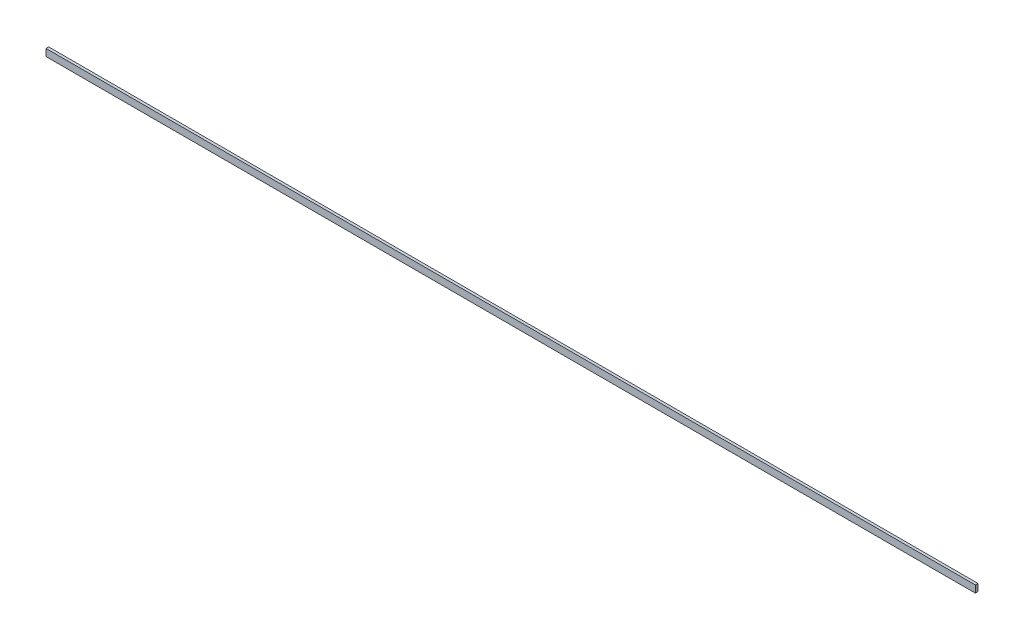
ISO-10303-21;
HEADER;
FILE_DESCRIPTION(('STEP AP214'),'2;1');
FILE_NAME('part.step','',(''),(''),'','','');
FILE_SCHEMA(('AUTOMOTIVE_DESIGN { 1 0 10303 214 1 1 1 1 }'));
ENDSEC;
DATA;
#1=APPLICATION_CONTEXT('core data for automotive mechanical design processes');
#2=APPLICATION_PROTOCOL_DEFINITION('international standard','automotive_design',2000,#1);
#3=PRODUCT_CONTEXT('',#1,'mechanical');
#4=PRODUCT('Part','Part','',(#3));
#5=PRODUCT_RELATED_PRODUCT_CATEGORY('part','',(#4));
#6=PRODUCT_DEFINITION_FORMATION('','',#4);
#7=PRODUCT_DEFINITION_CONTEXT('part definition',#1,'design');
#8=PRODUCT_DEFINITION('design','',#6,#7);
#9=PRODUCT_DEFINITION_SHAPE('','',#8);
#10=(LENGTH_UNIT() NAMED_UNIT(*) SI_UNIT(.MILLI.,.METRE.));
#11=(NAMED_UNIT(*) PLANE_ANGLE_UNIT() SI_UNIT($,.RADIAN.));
#12=(NAMED_UNIT(*) SI_UNIT($,.STERADIAN.) SOLID_ANGLE_UNIT());
#13=UNCERTAINTY_MEASURE_WITH_UNIT(LENGTH_MEASURE(1.E-05),#10,'distance_accuracy_value','');
#14=(GEOMETRIC_REPRESENTATION_CONTEXT(3) GLOBAL_UNCERTAINTY_ASSIGNED_CONTEXT((#13)) GLOBAL_UNIT_ASSIGNED_CONTEXT((#10,
#11,#12)) REPRESENTATION_CONTEXT('',''));
#15=CARTESIAN_POINT('',(0.,0.,0.));
#16=DIRECTION('',(0.,0.,1.));
#17=DIRECTION('',(1.,0.,0.));
#18=AXIS2_PLACEMENT_3D('',#15,#16,#17);
#19=CARTESIAN_POINT('',(0.,0.,1.5));
#20=DIRECTION('',(1.,0.,0.));
#21=DIRECTION('',(0.,0.,-1.));
#22=AXIS2_PLACEMENT_3D('',#19,#20,#21);
#23=PLANE('',#22);
#24=DIRECTION('',(0.,-1.,0.));
#25=VECTOR('',#24,1.);
#26=CARTESIAN_POINT('',(0.,0.,0.));
#27=LINE('',#26,#25);
#28=CARTESIAN_POINT('',(0.,0.,0.));
#29=VERTEX_POINT('',#28);
#30=CARTESIAN_POINT('',(0.,-4.,0.));
#31=VERTEX_POINT('',#30);
#32=EDGE_CURVE('E99',#29,#31,#27,.T.);
#33=ORIENTED_EDGE('',*,*,#32,.T.);
#34=DIRECTION('',(0.,0.,-1.));
#35=VECTOR('',#34,1.);
#36=CARTESIAN_POINT('',(0.,-4.,1.5));
#37=LINE('',#36,#35);
#38=CARTESIAN_POINT('',(0.,-4.,1.5));
#39=VERTEX_POINT('',#38);
#40=EDGE_CURVE('E11',#39,#31,#37,.T.);
#41=ORIENTED_EDGE('',*,*,#40,.F.);
#42=DIRECTION('',(0.,-1.,0.));
#43=VECTOR('',#42,1.);
#44=CARTESIAN_POINT('',(0.,0.,1.5));
#45=LINE('',#44,#43);
#46=CARTESIAN_POINT('',(0.,0.,1.5));
#47=VERTEX_POINT('',#46);
#48=EDGE_CURVE('E87',#47,#39,#45,.T.);
#49=ORIENTED_EDGE('',*,*,#48,.F.);
#50=DIRECTION('',(0.,0.,-1.));
#51=VECTOR('',#50,1.);
#52=CARTESIAN_POINT('',(0.,0.,1.5));
#53=LINE('',#52,#51);
#54=EDGE_CURVE('E95',#47,#29,#53,.T.);
#55=ORIENTED_EDGE('',*,*,#54,.T.);
#56=EDGE_LOOP('',(#33,#41,#49,#55));
#57=FACE_BOUND('',#56,.T.);
#58=ADVANCED_FACE('F36',(#57),#23,.F.);
#59=CARTESIAN_POINT('',(0.,-4.,1.5));
#60=DIRECTION('',(0.,1.,0.));
#61=DIRECTION('',(0.,0.,1.));
#62=AXIS2_PLACEMENT_3D('',#59,#60,#61);
#63=PLANE('',#62);
#64=DIRECTION('',(1.,0.,0.));
#65=VECTOR('',#64,1.);
#66=CARTESIAN_POINT('',(0.,-4.,0.));
#67=LINE('',#66,#65);
#68=CARTESIAN_POINT('',(525.,-4.,0.));
#69=VERTEX_POINT('',#68);
#70=EDGE_CURVE('E91',#31,#69,#67,.T.);
#71=ORIENTED_EDGE('',*,*,#70,.T.);
#72=DIRECTION('',(0.,0.,-1.));
#73=VECTOR('',#72,1.);
#74=CARTESIAN_POINT('',(525.,-4.,1.5));
#75=LINE('',#74,#73);
#76=CARTESIAN_POINT('',(525.,-4.,1.5));
#77=VERTEX_POINT('',#76);
#78=EDGE_CURVE('E44',#77,#69,#75,.T.);
#79=ORIENTED_EDGE('',*,*,#78,.F.);
#80=DIRECTION('',(1.,0.,0.));
#81=VECTOR('',#80,1.);
#82=CARTESIAN_POINT('',(0.,-4.,1.5));
#83=LINE('',#82,#81);
#84=EDGE_CURVE('E82',#39,#77,#83,.T.);
#85=ORIENTED_EDGE('',*,*,#84,.F.);
#86=ORIENTED_EDGE('',*,*,#40,.T.);
#87=EDGE_LOOP('',(#71,#79,#85,#86));
#88=FACE_BOUND('',#87,.T.);
#89=ADVANCED_FACE('F90',(#88),#63,.F.);
#90=CARTESIAN_POINT('',(525.,0.,1.5));
#91=DIRECTION('',(-1.,0.,0.));
#92=DIRECTION('',(0.,0.,1.));
#93=AXIS2_PLACEMENT_3D('',#90,#91,#92);
#94=PLANE('',#93);
#95=DIRECTION('',(0.,1.,0.));
#96=VECTOR('',#95,1.);
#97=CARTESIAN_POINT('',(525.,0.,0.));
#98=LINE('',#97,#96);
#99=CARTESIAN_POINT('',(525.,0.,0.));
#100=VERTEX_POINT('',#99);
#101=EDGE_CURVE('E69',#69,#100,#98,.T.);
#102=ORIENTED_EDGE('',*,*,#101,.T.);
#103=DIRECTION('',(0.,0.,-1.));
#104=VECTOR('',#103,1.);
#105=CARTESIAN_POINT('',(525.,0.,1.5));
#106=LINE('',#105,#104);
#107=CARTESIAN_POINT('',(525.,0.,1.5));
#108=VERTEX_POINT('',#107);
#109=EDGE_CURVE('E92',#108,#100,#106,.T.);
#110=ORIENTED_EDGE('',*,*,#109,.F.);
#111=DIRECTION('',(0.,1.,0.));
#112=VECTOR('',#111,1.);
#113=CARTESIAN_POINT('',(525.,0.,1.5));
#114=LINE('',#113,#112);
#115=EDGE_CURVE('E85',#77,#108,#114,.T.);
#116=ORIENTED_EDGE('',*,*,#115,.F.);
#117=ORIENTED_EDGE('',*,*,#78,.T.);
#118=EDGE_LOOP('',(#102,#110,#116,#117));
#119=FACE_BOUND('',#118,.T.);
#120=ADVANCED_FACE('F93',(#119),#94,.F.);
#121=CARTESIAN_POINT('',(0.,0.,1.5));
#122=DIRECTION('',(0.,-1.,0.));
#123=DIRECTION('',(0.,0.,-1.));
#124=AXIS2_PLACEMENT_3D('',#121,#122,#123);
#125=PLANE('',#124);
#126=DIRECTION('',(-1.,0.,0.));
#127=VECTOR('',#126,1.);
#128=CARTESIAN_POINT('',(0.,0.,0.));
#129=LINE('',#128,#127);
#130=EDGE_CURVE('E75',#100,#29,#129,.T.);
#131=ORIENTED_EDGE('',*,*,#130,.T.);
#132=ORIENTED_EDGE('',*,*,#54,.F.);
#133=DIRECTION('',(-1.,0.,0.));
#134=VECTOR('',#133,1.);
#135=CARTESIAN_POINT('',(0.,0.,1.5));
#136=LINE('',#135,#134);
#137=EDGE_CURVE('E52',#108,#47,#136,.T.);
#138=ORIENTED_EDGE('',*,*,#137,.F.);
#139=ORIENTED_EDGE('',*,*,#109,.T.);
#140=EDGE_LOOP('',(#131,#132,#138,#139));
#141=FACE_BOUND('',#140,.T.);
#142=ADVANCED_FACE('F106',(#141),#125,.F.);
#143=CARTESIAN_POINT('',(0.,0.,1.5));
#144=DIRECTION('',(0.,0.,1.));
#145=DIRECTION('',(1.,0.,0.));
#146=AXIS2_PLACEMENT_3D('',#143,#144,#145);
#147=PLANE('',#146);
#148=ORIENTED_EDGE('',*,*,#48,.T.);
#149=ORIENTED_EDGE('',*,*,#84,.T.);
#150=ORIENTED_EDGE('',*,*,#115,.T.);
#151=ORIENTED_EDGE('',*,*,#137,.T.);
#152=EDGE_LOOP('',(#148,#149,#150,#151));
#153=FACE_BOUND('',#152,.T.);
#154=ADVANCED_FACE('F83',(#153),#147,.T.);
#155=CARTESIAN_POINT('',(0.,0.,0.));
#156=DIRECTION('',(0.,0.,1.));
#157=DIRECTION('',(1.,0.,0.));
#158=AXIS2_PLACEMENT_3D('',#155,#156,#157);
#159=PLANE('',#158);
#160=ORIENTED_EDGE('',*,*,#32,.F.);
#161=ORIENTED_EDGE('',*,*,#130,.F.);
#162=ORIENTED_EDGE('',*,*,#101,.F.);
#163=ORIENTED_EDGE('',*,*,#70,.F.);
#164=EDGE_LOOP('',(#160,#161,#162,#163));
#165=FACE_BOUND('',#164,.T.);
#166=ADVANCED_FACE('F109',(#165),#159,.F.);
#167=CLOSED_SHELL('',(#58,#89,#120,#142,#154,#166));
#168=MANIFOLD_SOLID_BREP('B2',#167);
#169=ADVANCED_BREP_SHAPE_REPRESENTATION('',(#18,#168),#14);
#170=SHAPE_DEFINITION_REPRESENTATION(#9,#169);
ENDSEC;
END-ISO-10303-21;
